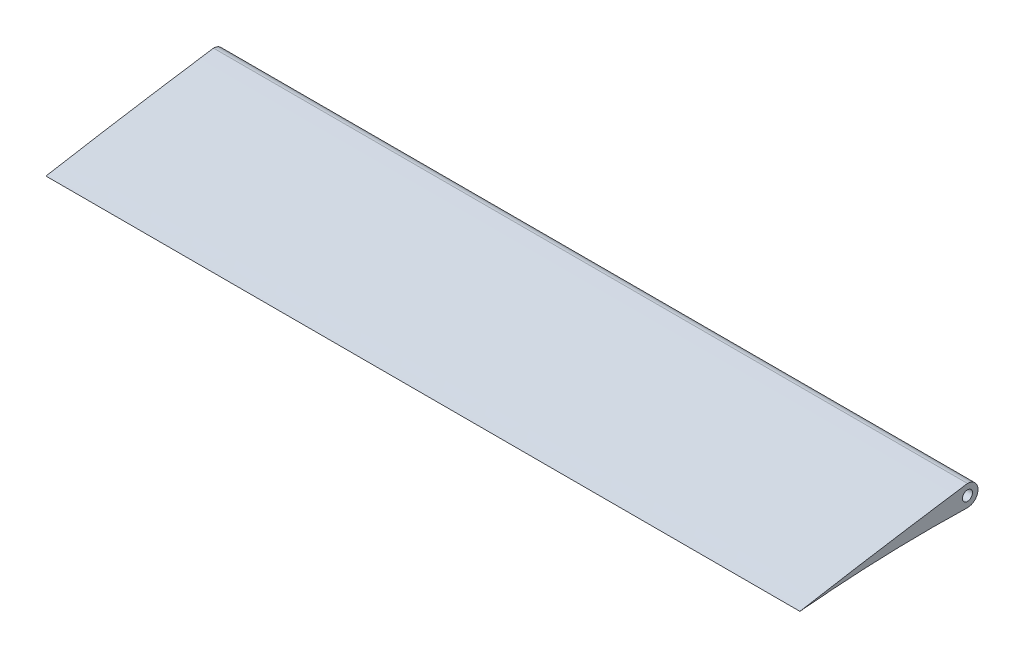
ISO-10303-21;
HEADER;
FILE_DESCRIPTION(('STEP AP214'),'2;1');
FILE_NAME('part.step','',(''),(''),'','','');
FILE_SCHEMA(('AUTOMOTIVE_DESIGN { 1 0 10303 214 1 1 1 1 }'));
ENDSEC;
DATA;
#1=APPLICATION_CONTEXT('core data for automotive mechanical design processes');
#2=APPLICATION_PROTOCOL_DEFINITION('international standard','automotive_design',2000,#1);
#3=PRODUCT_CONTEXT('',#1,'mechanical');
#4=PRODUCT('Part','Part','',(#3));
#5=PRODUCT_RELATED_PRODUCT_CATEGORY('part','',(#4));
#6=PRODUCT_DEFINITION_FORMATION('','',#4);
#7=PRODUCT_DEFINITION_CONTEXT('part definition',#1,'design');
#8=PRODUCT_DEFINITION('design','',#6,#7);
#9=PRODUCT_DEFINITION_SHAPE('','',#8);
#10=(LENGTH_UNIT() NAMED_UNIT(*) SI_UNIT(.MILLI.,.METRE.));
#11=(NAMED_UNIT(*) PLANE_ANGLE_UNIT() SI_UNIT($,.RADIAN.));
#12=(NAMED_UNIT(*) SI_UNIT($,.STERADIAN.) SOLID_ANGLE_UNIT());
#13=UNCERTAINTY_MEASURE_WITH_UNIT(LENGTH_MEASURE(1.E-05),#10,'distance_accuracy_value','');
#14=(GEOMETRIC_REPRESENTATION_CONTEXT(3) GLOBAL_UNCERTAINTY_ASSIGNED_CONTEXT((#13)) GLOBAL_UNIT_ASSIGNED_CONTEXT((#10,
#11,#12)) REPRESENTATION_CONTEXT('',''));
#15=CARTESIAN_POINT('',(0.,0.,0.));
#16=DIRECTION('',(0.,0.,1.));
#17=DIRECTION('',(1.,0.,0.));
#18=AXIS2_PLACEMENT_3D('',#15,#16,#17);
#19=CARTESIAN_POINT('',(225.,0.0269206644890282,249.853316674254));
#20=DIRECTION('',(-1.,0.,0.));
#21=DIRECTION('',(0.,0.,1.));
#22=AXIS2_PLACEMENT_3D('',#19,#20,#21);
#23=PLANE('',#22);
#24=CARTESIAN_POINT('',(225.,8.05930528950531,200.));
#25=CARTESIAN_POINT('',(225.,7.73975867618285,202.187379866089));
#26=CARTESIAN_POINT('',(225.,6.94925041958615,207.505720729808));
#27=CARTESIAN_POINT('',(225.,5.73122177085008,215.560350587429));
#28=CARTESIAN_POINT('',(225.,4.29329513146071,223.977157043251));
#29=CARTESIAN_POINT('',(225.,3.18180887934278,231.363413337264));
#30=CARTESIAN_POINT('',(225.,2.09894242404895,237.746440905393));
#31=CARTESIAN_POINT('',(225.,1.24586192427853,242.622069367074));
#32=CARTESIAN_POINT('',(225.,0.552864954565253,246.644529333807));
#33=CARTESIAN_POINT('',(225.,0.246216773274338,248.328398441758));
#34=CARTESIAN_POINT('',(225.,-0.0529666919521304,250.42732845939));
#35=CARTESIAN_POINT('',(225.,0.17237566659398,248.284955516936));
#36=CARTESIAN_POINT('',(225.,0.308690023107385,246.518112420767));
#37=CARTESIAN_POINT('',(225.,0.685693601393518,242.189387344711));
#38=CARTESIAN_POINT('',(225.,1.07410153549871,236.80646126474));
#39=CARTESIAN_POINT('',(225.,1.49731724526382,229.680385952807));
#40=CARTESIAN_POINT('',(225.,1.82321860647773,221.184158699391));
#41=CARTESIAN_POINT('',(225.,1.96762610272828,211.33761820881));
#42=CARTESIAN_POINT('',(225.,1.87929616202421,204.130566759099));
#43=CARTESIAN_POINT('',(225.,1.7814329165647,200.224163886594));
#44=CARTESIAN_POINT('',(225.,1.77565588982335,200.));
#45=B_SPLINE_CURVE_WITH_KNOTS('',3,(#24,#25,#26,#27,#28,#29,#30,#31,#32,#33,#34,#35,#36,#37,#38,
#39,#40,#41,#42,#43,#44),.UNSPECIFIED.,.F.,.F.,(4,1,1,1,1,1,1,1,1,1,1,1,1,1,1,1,1,1,4),
(0.900157669806231,0.913230871058069,0.931955467148994,0.94834206907442,0.963693004275676,
0.976235918239566,0.986320058750392,0.993788799349345,0.998424034933867,1.,1.00158888881615,
1.00632921783556,1.01420245648974,1.02517280775306,1.03917348332677,1.05606063117592,
1.07557892384879,1.09736360662969,1.09868981187535),.UNSPECIFIED.);
#46=CARTESIAN_POINT('',(225.,8.05930528947648,200.));
#47=VERTEX_POINT('',#46);
#48=CARTESIAN_POINT('',(225.,1.77565588982335,200.));
#49=VERTEX_POINT('',#48);
#50=EDGE_CURVE('E64',#47,#49,#45,.T.);
#51=ORIENTED_EDGE('',*,*,#50,.T.);
#52=CARTESIAN_POINT('',(225.,4.91748058964992,200.));
#53=DIRECTION('',(1.,0.,0.));
#54=DIRECTION('',(0.,0.,1.));
#55=AXIS2_PLACEMENT_3D('',#52,#53,#54);
#56=CIRCLE('',#55,3.14182469982657);
#57=EDGE_CURVE('E49',#49,#47,#56,.T.);
#58=ORIENTED_EDGE('',*,*,#57,.T.);
#59=EDGE_LOOP('',(#51,#58));
#60=FACE_BOUND('',#59,.T.);
#61=CARTESIAN_POINT('',(225.,4.91748058964992,200.));
#62=DIRECTION('',(1.,0.,0.));
#63=DIRECTION('',(0.,0.,-1.));
#64=AXIS2_PLACEMENT_3D('',#61,#62,#63);
#65=CIRCLE('',#64,1.5);
#66=CARTESIAN_POINT('',(225.,4.91748058964992,198.5));
#67=VERTEX_POINT('',#66);
#68=EDGE_CURVE('E70',#67,#67,#65,.T.);
#69=ORIENTED_EDGE('',*,*,#68,.F.);
#70=EDGE_LOOP('',(#69));
#71=FACE_BOUND('',#70,.T.);
#72=ADVANCED_FACE('F32',(#60,#71),#23,.F.);
#73=CARTESIAN_POINT('',(0.,0.0269206644890282,249.853316674254));
#74=DIRECTION('',(-1.,0.,0.));
#75=DIRECTION('',(0.,0.,1.));
#76=AXIS2_PLACEMENT_3D('',#73,#74,#75);
#77=PLANE('',#76);
#78=CARTESIAN_POINT('',(0.,8.05930528950531,200.));
#79=CARTESIAN_POINT('',(0.,7.73975867618285,202.187379866089));
#80=CARTESIAN_POINT('',(0.,6.94925041958615,207.505720729808));
#81=CARTESIAN_POINT('',(0.,5.73122177085008,215.560350587429));
#82=CARTESIAN_POINT('',(0.,4.29329513146071,223.977157043251));
#83=CARTESIAN_POINT('',(0.,3.18180887934278,231.363413337264));
#84=CARTESIAN_POINT('',(0.,2.09894242404895,237.746440905393));
#85=CARTESIAN_POINT('',(0.,1.24586192427853,242.622069367074));
#86=CARTESIAN_POINT('',(0.,0.552864954565253,246.644529333807));
#87=CARTESIAN_POINT('',(0.,0.246216773274338,248.328398441758));
#88=CARTESIAN_POINT('',(0.,-0.0529666919521304,250.42732845939));
#89=CARTESIAN_POINT('',(0.,0.17237566659398,248.284955516936));
#90=CARTESIAN_POINT('',(0.,0.308690023107385,246.518112420767));
#91=CARTESIAN_POINT('',(0.,0.685693601393518,242.189387344711));
#92=CARTESIAN_POINT('',(0.,1.07410153549871,236.80646126474));
#93=CARTESIAN_POINT('',(0.,1.49731724526382,229.680385952807));
#94=CARTESIAN_POINT('',(0.,1.82321860647773,221.184158699391));
#95=CARTESIAN_POINT('',(0.,1.96762610272828,211.33761820881));
#96=CARTESIAN_POINT('',(0.,1.87929616202421,204.130566759099));
#97=CARTESIAN_POINT('',(0.,1.7814329165647,200.224163886594));
#98=CARTESIAN_POINT('',(0.,1.77565588982335,200.));
#99=B_SPLINE_CURVE_WITH_KNOTS('',3,(#78,#79,#80,#81,#82,#83,#84,#85,#86,#87,#88,#89,#90,#91,#92,
#93,#94,#95,#96,#97,#98),.UNSPECIFIED.,.F.,.F.,(4,1,1,1,1,1,1,1,1,1,1,1,1,1,1,1,1,1,4),
(0.900157669806231,0.913230871058069,0.931955467148994,0.94834206907442,0.963693004275676,
0.976235918239566,0.986320058750392,0.993788799349345,0.998424034933867,1.,1.00158888881615,
1.00632921783556,1.01420245648974,1.02517280775306,1.03917348332677,1.05606063117592,
1.07557892384879,1.09736360662969,1.09868981187535),.UNSPECIFIED.);
#100=CARTESIAN_POINT('',(0.,8.05930528947648,200.));
#101=VERTEX_POINT('',#100);
#102=CARTESIAN_POINT('',(0.,1.77565588982335,200.));
#103=VERTEX_POINT('',#102);
#104=EDGE_CURVE('E65',#101,#103,#99,.T.);
#105=ORIENTED_EDGE('',*,*,#104,.F.);
#106=CARTESIAN_POINT('',(0.,4.91748058964992,200.));
#107=DIRECTION('',(1.,0.,0.));
#108=DIRECTION('',(0.,0.,1.));
#109=AXIS2_PLACEMENT_3D('',#106,#107,#108);
#110=CIRCLE('',#109,3.14182469982657);
#111=EDGE_CURVE('E57',#103,#101,#110,.T.);
#112=ORIENTED_EDGE('',*,*,#111,.F.);
#113=EDGE_LOOP('',(#105,#112));
#114=FACE_BOUND('',#113,.T.);
#115=CARTESIAN_POINT('',(0.,4.91748058964992,200.));
#116=DIRECTION('',(1.,0.,0.));
#117=DIRECTION('',(0.,0.,-1.));
#118=AXIS2_PLACEMENT_3D('',#115,#116,#117);
#119=CIRCLE('',#118,1.5);
#120=CARTESIAN_POINT('',(0.,4.91748058964992,198.5));
#121=VERTEX_POINT('',#120);
#122=EDGE_CURVE('E73',#121,#121,#119,.T.);
#123=ORIENTED_EDGE('',*,*,#122,.T.);
#124=EDGE_LOOP('',(#123));
#125=FACE_BOUND('',#124,.T.);
#126=ADVANCED_FACE('F68',(#114,#125),#77,.T.);
#127=DIRECTION('',(-1.,0.,0.));
#128=VECTOR('',#127,1.);
#129=SURFACE_OF_LINEAR_EXTRUSION('',#45,#128);
#130=ORIENTED_EDGE('',*,*,#104,.T.);
#131=DIRECTION('',(-1.,0.,0.));
#132=VECTOR('',#131,1.);
#133=CARTESIAN_POINT('',(225.,1.77565588982335,200.));
#134=LINE('',#133,#132);
#135=EDGE_CURVE('E11',#49,#103,#134,.T.);
#136=ORIENTED_EDGE('',*,*,#135,.F.);
#137=ORIENTED_EDGE('',*,*,#50,.F.);
#138=DIRECTION('',(-1.,0.,0.));
#139=VECTOR('',#138,1.);
#140=CARTESIAN_POINT('',(225.,8.05930528947648,200.));
#141=LINE('',#140,#139);
#142=EDGE_CURVE('E42',#47,#101,#141,.T.);
#143=ORIENTED_EDGE('',*,*,#142,.T.);
#144=EDGE_LOOP('',(#130,#136,#137,#143));
#145=FACE_BOUND('',#144,.T.);
#146=ADVANCED_FACE('F34',(#145),#129,.F.);
#147=CARTESIAN_POINT('',(225.,4.91748058964992,200.));
#148=DIRECTION('',(-1.,0.,0.));
#149=DIRECTION('',(0.,0.,1.));
#150=AXIS2_PLACEMENT_3D('',#147,#148,#149);
#151=CYLINDRICAL_SURFACE('',#150,3.14182469982657);
#152=ORIENTED_EDGE('',*,*,#111,.T.);
#153=ORIENTED_EDGE('',*,*,#142,.F.);
#154=ORIENTED_EDGE('',*,*,#57,.F.);
#155=ORIENTED_EDGE('',*,*,#135,.T.);
#156=EDGE_LOOP('',(#152,#153,#154,#155));
#157=FACE_BOUND('',#156,.T.);
#158=ADVANCED_FACE('F60',(#157),#151,.T.);
#159=CARTESIAN_POINT('',(225.,4.91748058964992,200.));
#160=DIRECTION('',(-1.,0.,0.));
#161=DIRECTION('',(0.,0.,1.));
#162=AXIS2_PLACEMENT_3D('',#159,#160,#161);
#163=CYLINDRICAL_SURFACE('',#162,1.5);
#164=ORIENTED_EDGE('',*,*,#68,.T.);
#165=EDGE_LOOP('',(#164));
#166=FACE_BOUND('',#165,.T.);
#167=ORIENTED_EDGE('',*,*,#122,.F.);
#168=EDGE_LOOP('',(#167));
#169=FACE_BOUND('',#168,.T.);
#170=ADVANCED_FACE('F91',(#166,#169),#163,.F.);
#171=CLOSED_SHELL('',(#72,#126,#146,#158,#170));
#172=MANIFOLD_SOLID_BREP('B2',#171);
#173=ADVANCED_BREP_SHAPE_REPRESENTATION('',(#18,#172),#14);
#174=SHAPE_DEFINITION_REPRESENTATION(#9,#173);
ENDSEC;
END-ISO-10303-21;
